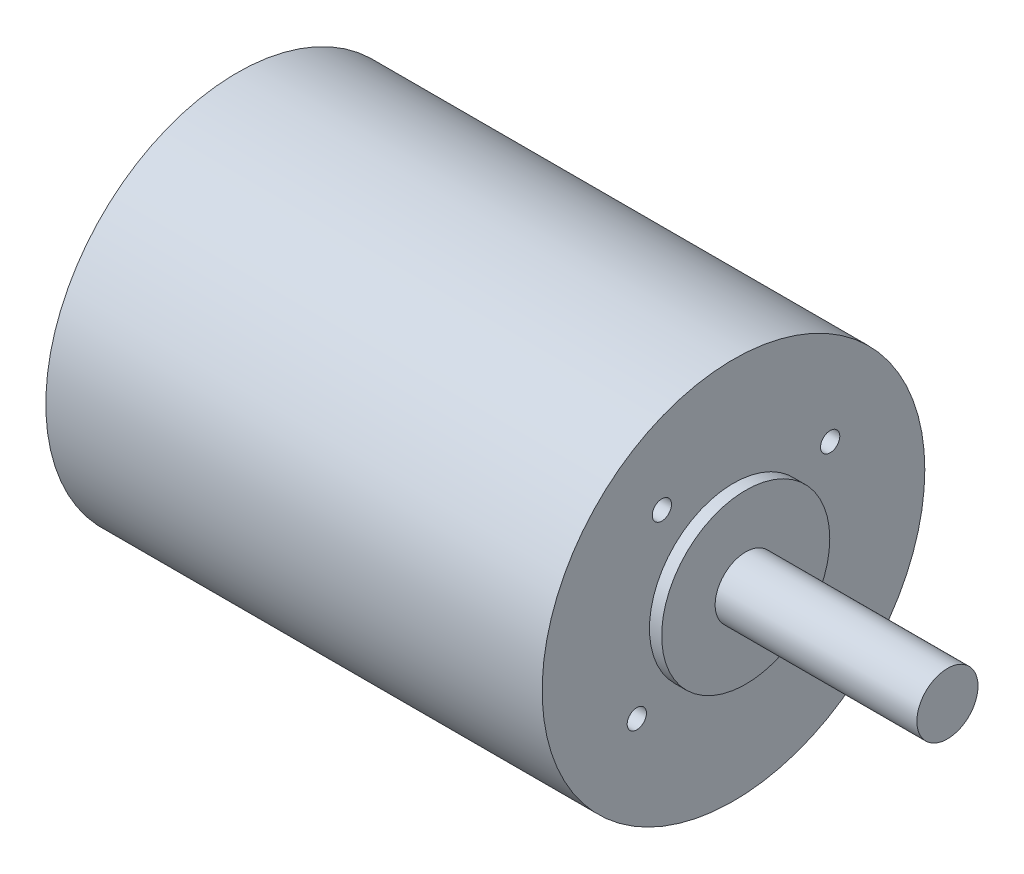
ISO-10303-21;
HEADER;
FILE_DESCRIPTION(('STEP AP214'),'2;1');
FILE_NAME('part.step','',(''),(''),'','','');
FILE_SCHEMA(('AUTOMOTIVE_DESIGN { 1 0 10303 214 1 1 1 1 }'));
ENDSEC;
DATA;
#1=APPLICATION_CONTEXT('core data for automotive mechanical design processes');
#2=APPLICATION_PROTOCOL_DEFINITION('international standard','automotive_design',2000,#1);
#3=PRODUCT_CONTEXT('',#1,'mechanical');
#4=PRODUCT('Part','Part','',(#3));
#5=PRODUCT_RELATED_PRODUCT_CATEGORY('part','',(#4));
#6=PRODUCT_DEFINITION_FORMATION('','',#4);
#7=PRODUCT_DEFINITION_CONTEXT('part definition',#1,'design');
#8=PRODUCT_DEFINITION('design','',#6,#7);
#9=PRODUCT_DEFINITION_SHAPE('','',#8);
#10=(LENGTH_UNIT() NAMED_UNIT(*) SI_UNIT(.MILLI.,.METRE.));
#11=(NAMED_UNIT(*) PLANE_ANGLE_UNIT() SI_UNIT($,.RADIAN.));
#12=(NAMED_UNIT(*) SI_UNIT($,.STERADIAN.) SOLID_ANGLE_UNIT());
#13=UNCERTAINTY_MEASURE_WITH_UNIT(LENGTH_MEASURE(1.E-05),#10,'distance_accuracy_value','');
#14=(GEOMETRIC_REPRESENTATION_CONTEXT(3) GLOBAL_UNCERTAINTY_ASSIGNED_CONTEXT((#13)) GLOBAL_UNIT_ASSIGNED_CONTEXT((#10,
#11,#12)) REPRESENTATION_CONTEXT('',''));
#15=CARTESIAN_POINT('',(0.,0.,0.));
#16=DIRECTION('',(0.,0.,1.));
#17=DIRECTION('',(1.,0.,0.));
#18=AXIS2_PLACEMENT_3D('',#15,#16,#17);
#19=CARTESIAN_POINT('',(103.124,0.,0.));
#20=DIRECTION('',(-1.,0.,0.));
#21=DIRECTION('',(0.,0.,1.));
#22=AXIS2_PLACEMENT_3D('',#19,#20,#21);
#23=CYLINDRICAL_SURFACE('',#22,39.751);
#24=CARTESIAN_POINT('',(103.124,0.,0.));
#25=DIRECTION('',(1.,0.,0.));
#26=DIRECTION('',(0.,0.,-1.));
#27=AXIS2_PLACEMENT_3D('',#24,#25,#26);
#28=CIRCLE('',#27,39.751);
#29=CARTESIAN_POINT('',(103.124,0.,-39.751));
#30=VERTEX_POINT('',#29);
#31=EDGE_CURVE('E41',#30,#30,#28,.T.);
#32=ORIENTED_EDGE('',*,*,#31,.F.);
#33=EDGE_LOOP('',(#32));
#34=FACE_BOUND('',#33,.T.);
#35=CARTESIAN_POINT('',(0.,0.,0.));
#36=DIRECTION('',(1.,0.,0.));
#37=DIRECTION('',(0.,0.,-1.));
#38=AXIS2_PLACEMENT_3D('',#35,#36,#37);
#39=CIRCLE('',#38,39.751);
#40=CARTESIAN_POINT('',(0.,0.,-39.751));
#41=VERTEX_POINT('',#40);
#42=EDGE_CURVE('E45',#41,#41,#39,.T.);
#43=ORIENTED_EDGE('',*,*,#42,.T.);
#44=EDGE_LOOP('',(#43));
#45=FACE_BOUND('',#44,.T.);
#46=ADVANCED_FACE('F35',(#34,#45),#23,.T.);
#47=CARTESIAN_POINT('',(103.124,0.,0.));
#48=DIRECTION('',(1.,0.,0.));
#49=DIRECTION('',(0.,0.,-1.));
#50=AXIS2_PLACEMENT_3D('',#47,#48,#49);
#51=PLANE('',#50);
#52=CARTESIAN_POINT('',(103.124,14.8824200748502,-20.0860044423507));
#53=DIRECTION('',(1.,0.,0.));
#54=DIRECTION('',(0.,0.,-1.));
#55=AXIS2_PLACEMENT_3D('',#52,#53,#54);
#56=CIRCLE('',#55,1.99999600000097);
#57=CARTESIAN_POINT('',(103.124,14.8824200748502,-22.0860004423516));
#58=VERTEX_POINT('',#57);
#59=EDGE_CURVE('E85',#58,#58,#56,.T.);
#60=ORIENTED_EDGE('',*,*,#59,.F.);
#61=EDGE_LOOP('',(#60));
#62=FACE_BOUND('',#61,.T.);
#63=CARTESIAN_POINT('',(103.124,-20.0860044423497,-14.8824200748504));
#64=DIRECTION('',(1.,0.,0.));
#65=DIRECTION('',(0.,0.,-1.));
#66=AXIS2_PLACEMENT_3D('',#63,#64,#65);
#67=CIRCLE('',#66,1.99999600000148);
#68=CARTESIAN_POINT('',(103.124,-20.0860044423497,-16.8824160748518));
#69=VERTEX_POINT('',#68);
#70=EDGE_CURVE('E79',#69,#69,#67,.T.);
#71=ORIENTED_EDGE('',*,*,#70,.F.);
#72=EDGE_LOOP('',(#71));
#73=FACE_BOUND('',#72,.T.);
#74=CARTESIAN_POINT('',(103.124,-14.8824200748494,20.0860044423495));
#75=DIRECTION('',(1.,0.,0.));
#76=DIRECTION('',(0.,0.,-1.));
#77=AXIS2_PLACEMENT_3D('',#74,#75,#76);
#78=CIRCLE('',#77,1.99999600000067);
#79=CARTESIAN_POINT('',(103.124,-14.8824200748494,18.0860084423489));
#80=VERTEX_POINT('',#79);
#81=EDGE_CURVE('E73',#80,#80,#78,.T.);
#82=ORIENTED_EDGE('',*,*,#81,.F.);
#83=EDGE_LOOP('',(#82));
#84=FACE_BOUND('',#83,.T.);
#85=CARTESIAN_POINT('',(103.124,20.0860044423505,14.8824200748492));
#86=DIRECTION('',(1.,0.,0.));
#87=DIRECTION('',(0.,0.,-1.));
#88=AXIS2_PLACEMENT_3D('',#85,#86,#87);
#89=CIRCLE('',#88,1.999996);
#90=CARTESIAN_POINT('',(103.124,20.0860044423505,12.8824240748492));
#91=VERTEX_POINT('',#90);
#92=EDGE_CURVE('E67',#91,#91,#89,.T.);
#93=ORIENTED_EDGE('',*,*,#92,.F.);
#94=EDGE_LOOP('',(#93));
#95=FACE_BOUND('',#94,.T.);
#96=CARTESIAN_POINT('',(103.124,0.,0.));
#97=DIRECTION('',(1.,0.,0.));
#98=DIRECTION('',(0.,0.,-1.));
#99=AXIS2_PLACEMENT_3D('',#96,#97,#98);
#100=CIRCLE('',#99,17.4625);
#101=CARTESIAN_POINT('',(103.124,0.,-17.4625));
#102=VERTEX_POINT('',#101);
#103=EDGE_CURVE('E52',#102,#102,#100,.T.);
#104=ORIENTED_EDGE('',*,*,#103,.F.);
#105=EDGE_LOOP('',(#104));
#106=FACE_BOUND('',#105,.T.);
#107=ORIENTED_EDGE('',*,*,#31,.T.);
#108=EDGE_LOOP('',(#107));
#109=FACE_BOUND('',#108,.T.);
#110=ADVANCED_FACE('F100',(#62,#73,#84,#95,#106,#109),#51,.T.);
#111=CARTESIAN_POINT('',(0.,0.,0.));
#112=DIRECTION('',(1.,0.,0.));
#113=DIRECTION('',(0.,0.,-1.));
#114=AXIS2_PLACEMENT_3D('',#111,#112,#113);
#115=PLANE('',#114);
#116=CARTESIAN_POINT('',(0.,0.,0.));
#117=DIRECTION('',(1.,0.,0.));
#118=DIRECTION('',(0.,0.,-1.));
#119=AXIS2_PLACEMENT_3D('',#116,#117,#118);
#120=CIRCLE('',#119,6.35);
#121=CARTESIAN_POINT('',(0.,0.,-6.35));
#122=VERTEX_POINT('',#121);
#123=EDGE_CURVE('E10',#122,#122,#120,.F.);
#124=ORIENTED_EDGE('',*,*,#123,.F.);
#125=EDGE_LOOP('',(#124));
#126=FACE_BOUND('',#125,.T.);
#127=ORIENTED_EDGE('',*,*,#42,.F.);
#128=EDGE_LOOP('',(#127));
#129=FACE_BOUND('',#128,.T.);
#130=ADVANCED_FACE('F103',(#126,#129),#115,.F.);
#131=CARTESIAN_POINT('',(105.664,0.,0.));
#132=DIRECTION('',(-1.,0.,0.));
#133=DIRECTION('',(0.,0.,1.));
#134=AXIS2_PLACEMENT_3D('',#131,#132,#133);
#135=CYLINDRICAL_SURFACE('',#134,17.4625);
#136=CARTESIAN_POINT('',(105.664,0.,0.));
#137=DIRECTION('',(1.,0.,0.));
#138=DIRECTION('',(0.,0.,-1.));
#139=AXIS2_PLACEMENT_3D('',#136,#137,#138);
#140=CIRCLE('',#139,17.4625);
#141=CARTESIAN_POINT('',(105.664,0.,-17.4625));
#142=VERTEX_POINT('',#141);
#143=EDGE_CURVE('E50',#142,#142,#140,.T.);
#144=ORIENTED_EDGE('',*,*,#143,.F.);
#145=EDGE_LOOP('',(#144));
#146=FACE_BOUND('',#145,.T.);
#147=ORIENTED_EDGE('',*,*,#103,.T.);
#148=EDGE_LOOP('',(#147));
#149=FACE_BOUND('',#148,.T.);
#150=ADVANCED_FACE('F113',(#146,#149),#135,.T.);
#151=CARTESIAN_POINT('',(105.664,0.,0.));
#152=DIRECTION('',(1.,0.,0.));
#153=DIRECTION('',(0.,0.,-1.));
#154=AXIS2_PLACEMENT_3D('',#151,#152,#153);
#155=PLANE('',#154);
#156=CARTESIAN_POINT('',(105.664,0.,0.));
#157=DIRECTION('',(1.,0.,0.));
#158=DIRECTION('',(0.,0.,-1.));
#159=AXIS2_PLACEMENT_3D('',#156,#157,#158);
#160=CIRCLE('',#159,6.35);
#161=CARTESIAN_POINT('',(105.664,0.,-6.35));
#162=VERTEX_POINT('',#161);
#163=EDGE_CURVE('E58',#162,#162,#160,.T.);
#164=ORIENTED_EDGE('',*,*,#163,.F.);
#165=EDGE_LOOP('',(#164));
#166=FACE_BOUND('',#165,.T.);
#167=ORIENTED_EDGE('',*,*,#143,.T.);
#168=EDGE_LOOP('',(#167));
#169=FACE_BOUND('',#168,.T.);
#170=ADVANCED_FACE('F115',(#166,#169),#155,.T.);
#171=CARTESIAN_POINT('',(147.574,0.,0.));
#172=DIRECTION('',(-1.,0.,0.));
#173=DIRECTION('',(0.,0.,1.));
#174=AXIS2_PLACEMENT_3D('',#171,#172,#173);
#175=CYLINDRICAL_SURFACE('',#174,6.35);
#176=CARTESIAN_POINT('',(147.574,0.,0.));
#177=DIRECTION('',(1.,0.,0.));
#178=DIRECTION('',(0.,0.,-1.));
#179=AXIS2_PLACEMENT_3D('',#176,#177,#178);
#180=CIRCLE('',#179,6.35);
#181=CARTESIAN_POINT('',(147.574,0.,-6.35));
#182=VERTEX_POINT('',#181);
#183=EDGE_CURVE('E55',#182,#182,#180,.T.);
#184=ORIENTED_EDGE('',*,*,#183,.F.);
#185=EDGE_LOOP('',(#184));
#186=FACE_BOUND('',#185,.T.);
#187=ORIENTED_EDGE('',*,*,#163,.T.);
#188=EDGE_LOOP('',(#187));
#189=FACE_BOUND('',#188,.T.);
#190=ADVANCED_FACE('F122',(#186,#189),#175,.T.);
#191=CARTESIAN_POINT('',(147.574,0.,0.));
#192=DIRECTION('',(1.,0.,0.));
#193=DIRECTION('',(0.,0.,-1.));
#194=AXIS2_PLACEMENT_3D('',#191,#192,#193);
#195=PLANE('',#194);
#196=ORIENTED_EDGE('',*,*,#183,.T.);
#197=EDGE_LOOP('',(#196));
#198=FACE_BOUND('',#197,.T.);
#199=ADVANCED_FACE('F153',(#198),#195,.T.);
#200=CARTESIAN_POINT('',(-14.224,0.,0.));
#201=DIRECTION('',(1.,0.,0.));
#202=DIRECTION('',(0.,0.,-1.));
#203=AXIS2_PLACEMENT_3D('',#200,#201,#202);
#204=CYLINDRICAL_SURFACE('',#203,6.35);
#205=CARTESIAN_POINT('',(-14.224,0.,0.));
#206=DIRECTION('',(-1.,0.,0.));
#207=DIRECTION('',(0.,0.,1.));
#208=AXIS2_PLACEMENT_3D('',#205,#206,#207);
#209=CIRCLE('',#208,6.35);
#210=CARTESIAN_POINT('',(-14.224,0.,6.35));
#211=VERTEX_POINT('',#210);
#212=EDGE_CURVE('E61',#211,#211,#209,.T.);
#213=ORIENTED_EDGE('',*,*,#212,.F.);
#214=EDGE_LOOP('',(#213));
#215=FACE_BOUND('',#214,.T.);
#216=ORIENTED_EDGE('',*,*,#123,.T.);
#217=EDGE_LOOP('',(#216));
#218=FACE_BOUND('',#217,.T.);
#219=ADVANCED_FACE('F158',(#215,#218),#204,.T.);
#220=CARTESIAN_POINT('',(-14.224,0.,0.));
#221=DIRECTION('',(-1.,0.,0.));
#222=DIRECTION('',(0.,0.,1.));
#223=AXIS2_PLACEMENT_3D('',#220,#221,#222);
#224=PLANE('',#223);
#225=ORIENTED_EDGE('',*,*,#212,.T.);
#226=EDGE_LOOP('',(#225));
#227=FACE_BOUND('',#226,.T.);
#228=ADVANCED_FACE('F162',(#227),#224,.T.);
#229=CARTESIAN_POINT('',(96.266,20.0860044423505,14.8824200748492));
#230=DIRECTION('',(1.,0.,0.));
#231=DIRECTION('',(0.,0.,-1.));
#232=AXIS2_PLACEMENT_3D('',#229,#230,#231);
#233=CYLINDRICAL_SURFACE('',#232,1.999996);
#234=CARTESIAN_POINT('',(96.266,20.0860044423505,14.8824200748492));
#235=DIRECTION('',(1.,0.,0.));
#236=DIRECTION('',(0.,0.,-1.));
#237=AXIS2_PLACEMENT_3D('',#234,#235,#236);
#238=CIRCLE('',#237,1.999996);
#239=CARTESIAN_POINT('',(96.266,20.0860044423505,12.8824240748492));
#240=VERTEX_POINT('',#239);
#241=EDGE_CURVE('E66',#240,#240,#238,.T.);
#242=ORIENTED_EDGE('',*,*,#241,.F.);
#243=EDGE_LOOP('',(#242));
#244=FACE_BOUND('',#243,.T.);
#245=ORIENTED_EDGE('',*,*,#92,.T.);
#246=EDGE_LOOP('',(#245));
#247=FACE_BOUND('',#246,.T.);
#248=ADVANCED_FACE('F171',(#244,#247),#233,.F.);
#249=CARTESIAN_POINT('',(96.266,20.0860044423505,14.8824200748492));
#250=DIRECTION('',(1.,0.,0.));
#251=DIRECTION('',(0.,0.,-1.));
#252=AXIS2_PLACEMENT_3D('',#249,#250,#251);
#253=PLANE('',#252);
#254=ORIENTED_EDGE('',*,*,#241,.T.);
#255=EDGE_LOOP('',(#254));
#256=FACE_BOUND('',#255,.T.);
#257=ADVANCED_FACE('F181',(#256),#253,.T.);
#258=CARTESIAN_POINT('',(96.266,-14.8824200748494,20.0860044423495));
#259=DIRECTION('',(1.,0.,0.));
#260=DIRECTION('',(0.,0.,-1.));
#261=AXIS2_PLACEMENT_3D('',#258,#259,#260);
#262=CYLINDRICAL_SURFACE('',#261,1.99999600000067);
#263=CARTESIAN_POINT('',(96.266,-14.8824200748494,20.0860044423495));
#264=DIRECTION('',(1.,0.,0.));
#265=DIRECTION('',(0.,0.,-1.));
#266=AXIS2_PLACEMENT_3D('',#263,#264,#265);
#267=CIRCLE('',#266,1.99999600000067);
#268=CARTESIAN_POINT('',(96.266,-14.8824200748494,18.0860084423489));
#269=VERTEX_POINT('',#268);
#270=EDGE_CURVE('E76',#269,#269,#267,.T.);
#271=ORIENTED_EDGE('',*,*,#270,.F.);
#272=EDGE_LOOP('',(#271));
#273=FACE_BOUND('',#272,.T.);
#274=ORIENTED_EDGE('',*,*,#81,.T.);
#275=EDGE_LOOP('',(#274));
#276=FACE_BOUND('',#275,.T.);
#277=ADVANCED_FACE('F188',(#273,#276),#262,.F.);
#278=CARTESIAN_POINT('',(96.266,-14.8824200748494,20.0860044423495));
#279=DIRECTION('',(1.,0.,0.));
#280=DIRECTION('',(0.,0.,-1.));
#281=AXIS2_PLACEMENT_3D('',#278,#279,#280);
#282=PLANE('',#281);
#283=ORIENTED_EDGE('',*,*,#270,.T.);
#284=EDGE_LOOP('',(#283));
#285=FACE_BOUND('',#284,.T.);
#286=ADVANCED_FACE('F196',(#285),#282,.T.);
#287=CARTESIAN_POINT('',(96.266,-20.0860044423497,-14.8824200748504));
#288=DIRECTION('',(1.,0.,0.));
#289=DIRECTION('',(0.,0.,-1.));
#290=AXIS2_PLACEMENT_3D('',#287,#288,#289);
#291=CYLINDRICAL_SURFACE('',#290,1.99999600000148);
#292=CARTESIAN_POINT('',(96.266,-20.0860044423497,-14.8824200748504));
#293=DIRECTION('',(1.,0.,0.));
#294=DIRECTION('',(0.,0.,-1.));
#295=AXIS2_PLACEMENT_3D('',#292,#293,#294);
#296=CIRCLE('',#295,1.99999600000148);
#297=CARTESIAN_POINT('',(96.266,-20.0860044423497,-16.8824160748518));
#298=VERTEX_POINT('',#297);
#299=EDGE_CURVE('E82',#298,#298,#296,.T.);
#300=ORIENTED_EDGE('',*,*,#299,.F.);
#301=EDGE_LOOP('',(#300));
#302=FACE_BOUND('',#301,.T.);
#303=ORIENTED_EDGE('',*,*,#70,.T.);
#304=EDGE_LOOP('',(#303));
#305=FACE_BOUND('',#304,.T.);
#306=ADVANCED_FACE('F204',(#302,#305),#291,.F.);
#307=CARTESIAN_POINT('',(96.266,-20.0860044423497,-14.8824200748504));
#308=DIRECTION('',(1.,0.,0.));
#309=DIRECTION('',(0.,0.,-1.));
#310=AXIS2_PLACEMENT_3D('',#307,#308,#309);
#311=PLANE('',#310);
#312=ORIENTED_EDGE('',*,*,#299,.T.);
#313=EDGE_LOOP('',(#312));
#314=FACE_BOUND('',#313,.T.);
#315=ADVANCED_FACE('F96',(#314),#311,.T.);
#316=CARTESIAN_POINT('',(96.266,14.8824200748502,-20.0860044423507));
#317=DIRECTION('',(1.,0.,0.));
#318=DIRECTION('',(0.,0.,-1.));
#319=AXIS2_PLACEMENT_3D('',#316,#317,#318);
#320=CYLINDRICAL_SURFACE('',#319,1.99999600000097);
#321=CARTESIAN_POINT('',(96.266,14.8824200748502,-20.0860044423507));
#322=DIRECTION('',(1.,0.,0.));
#323=DIRECTION('',(0.,0.,-1.));
#324=AXIS2_PLACEMENT_3D('',#321,#322,#323);
#325=CIRCLE('',#324,1.99999600000097);
#326=CARTESIAN_POINT('',(96.266,14.8824200748502,-22.0860004423516));
#327=VERTEX_POINT('',#326);
#328=EDGE_CURVE('E70',#327,#327,#325,.T.);
#329=ORIENTED_EDGE('',*,*,#328,.F.);
#330=EDGE_LOOP('',(#329));
#331=FACE_BOUND('',#330,.T.);
#332=ORIENTED_EDGE('',*,*,#59,.T.);
#333=EDGE_LOOP('',(#332));
#334=FACE_BOUND('',#333,.T.);
#335=ADVANCED_FACE('F93',(#331,#334),#320,.F.);
#336=CARTESIAN_POINT('',(96.266,14.8824200748502,-20.0860044423507));
#337=DIRECTION('',(1.,0.,0.));
#338=DIRECTION('',(0.,0.,-1.));
#339=AXIS2_PLACEMENT_3D('',#336,#337,#338);
#340=PLANE('',#339);
#341=ORIENTED_EDGE('',*,*,#328,.T.);
#342=EDGE_LOOP('',(#341));
#343=FACE_BOUND('',#342,.T.);
#344=ADVANCED_FACE('F91',(#343),#340,.T.);
#345=CLOSED_SHELL('',(#46,#110,#130,#150,#170,#190,#199,#219,#228,#248,#257,#277,#286,#306,#315,
#335,#344));
#346=MANIFOLD_SOLID_BREP('B2',#345);
#347=ADVANCED_BREP_SHAPE_REPRESENTATION('',(#18,#346),#14);
#348=SHAPE_DEFINITION_REPRESENTATION(#9,#347);
ENDSEC;
END-ISO-10303-21;
